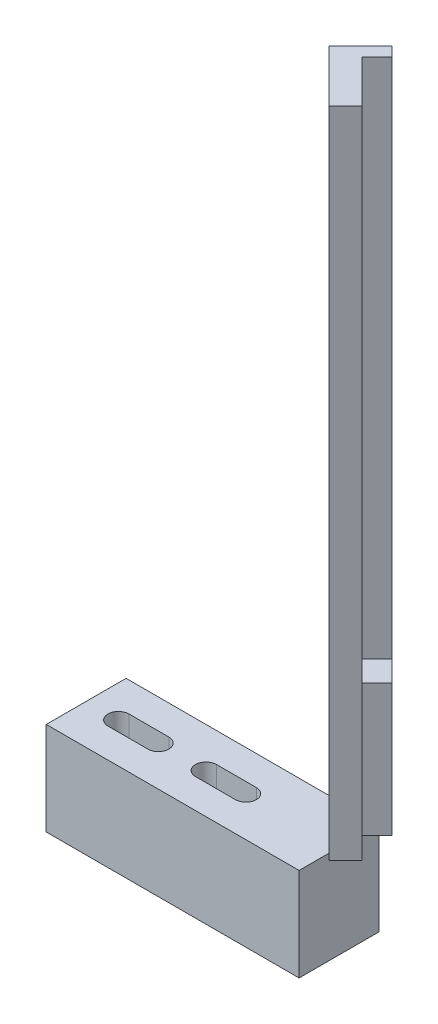
ISO-10303-21;
HEADER;
FILE_DESCRIPTION(('STEP AP214'),'2;1');
FILE_NAME('part.step','',(''),(''),'','','');
FILE_SCHEMA(('AUTOMOTIVE_DESIGN { 1 0 10303 214 1 1 1 1 }'));
ENDSEC;
DATA;
#1=APPLICATION_CONTEXT('core data for automotive mechanical design processes');
#2=APPLICATION_PROTOCOL_DEFINITION('international standard','automotive_design',2000,#1);
#3=PRODUCT_CONTEXT('',#1,'mechanical');
#4=PRODUCT('Part','Part','',(#3));
#5=PRODUCT_RELATED_PRODUCT_CATEGORY('part','',(#4));
#6=PRODUCT_DEFINITION_FORMATION('','',#4);
#7=PRODUCT_DEFINITION_CONTEXT('part definition',#1,'design');
#8=PRODUCT_DEFINITION('design','',#6,#7);
#9=PRODUCT_DEFINITION_SHAPE('','',#8);
#10=(LENGTH_UNIT() NAMED_UNIT(*) SI_UNIT(.MILLI.,.METRE.));
#11=(NAMED_UNIT(*) PLANE_ANGLE_UNIT() SI_UNIT($,.RADIAN.));
#12=(NAMED_UNIT(*) SI_UNIT($,.STERADIAN.) SOLID_ANGLE_UNIT());
#13=UNCERTAINTY_MEASURE_WITH_UNIT(LENGTH_MEASURE(1.E-05),#10,'distance_accuracy_value','');
#14=(GEOMETRIC_REPRESENTATION_CONTEXT(3) GLOBAL_UNCERTAINTY_ASSIGNED_CONTEXT((#13)) GLOBAL_UNIT_ASSIGNED_CONTEXT((#10,
#11,#12)) REPRESENTATION_CONTEXT('',''));
#15=CARTESIAN_POINT('',(0.,0.,0.));
#16=DIRECTION('',(0.,0.,1.));
#17=DIRECTION('',(1.,0.,0.));
#18=AXIS2_PLACEMENT_3D('',#15,#16,#17);
#19=CARTESIAN_POINT('',(30.1404135797826,142.4999944,-30.1404135797826));
#20=DIRECTION('',(-0.707106781186547,0.,0.707106781186548));
#21=DIRECTION('',(0.707106781186548,0.,0.707106781186547));
#22=AXIS2_PLACEMENT_3D('',#19,#20,#21);
#23=PLANE('',#22);
#24=CARTESIAN_POINT('',(48.0646243137283,56.6999882,-12.2162028458368));
#25=DIRECTION('',(0.707106781186551,0.,-0.707106781186544));
#26=DIRECTION('',(-0.707106781186544,0.,-0.707106781186551));
#27=AXIS2_PLACEMENT_3D('',#24,#25,#26);
#28=CIRCLE('',#27,0.749999999999987);
#29=CARTESIAN_POINT('',(47.5342942278384,56.6999882,-12.7465329317267));
#30=VERTEX_POINT('',#29);
#31=EDGE_CURVE('E388',#30,#30,#28,.T.);
#32=ORIENTED_EDGE('',*,*,#31,.F.);
#33=EDGE_LOOP('',(#32));
#34=FACE_BOUND('',#33,.T.);
#35=DIRECTION('',(0.,-1.,0.));
#36=VECTOR('',#35,1.);
#37=CARTESIAN_POINT('',(48.4888834029946,42.9999902,-11.7919437565706));
#38=LINE('',#37,#36);
#39=CARTESIAN_POINT('',(48.4888834029946,42.9999902,-11.7919437565706));
#40=VERTEX_POINT('',#39);
#41=CARTESIAN_POINT('',(48.4888834029946,17.78,-11.7919437565707));
#42=VERTEX_POINT('',#41);
#43=EDGE_CURVE('E54',#40,#42,#38,.T.);
#44=ORIENTED_EDGE('',*,*,#43,.F.);
#45=DIRECTION('',(-0.707106781186548,0.,-0.707106781186547));
#46=VECTOR('',#45,1.);
#47=CARTESIAN_POINT('',(30.1404135797826,42.9999902,-30.1404135797826));
#48=LINE('',#47,#46);
#49=CARTESIAN_POINT('',(44.5290974788637,42.9999902,-15.7517296807016));
#50=VERTEX_POINT('',#49);
#51=EDGE_CURVE('E59',#40,#50,#48,.T.);
#52=ORIENTED_EDGE('',*,*,#51,.T.);
#53=DIRECTION('',(0.,-1.,0.));
#54=VECTOR('',#53,1.);
#55=CARTESIAN_POINT('',(44.5290974788637,142.4999944,-15.7517296807016));
#56=LINE('',#55,#54);
#57=CARTESIAN_POINT('',(44.5290974788637,142.4999944,-15.7517296807016));
#58=VERTEX_POINT('',#57);
#59=EDGE_CURVE('E240',#58,#50,#56,.T.);
#60=ORIENTED_EDGE('',*,*,#59,.F.);
#61=DIRECTION('',(-0.707106781186548,0.,-0.707106781186547));
#62=VECTOR('',#61,1.);
#63=CARTESIAN_POINT('',(30.1404135797826,142.4999944,-30.1404135797826));
#64=LINE('',#63,#62);
#65=CARTESIAN_POINT('',(52.6608284168011,142.4999944,-7.61999874276412));
#66=VERTEX_POINT('',#65);
#67=EDGE_CURVE('E217',#66,#58,#64,.T.);
#68=ORIENTED_EDGE('',*,*,#67,.F.);
#69=DIRECTION('',(0.,-1.,0.));
#70=VECTOR('',#69,1.);
#71=CARTESIAN_POINT('',(52.6608284168011,142.4999944,-7.61999874276412));
#72=LINE('',#71,#70);
#73=CARTESIAN_POINT('',(52.6608284168012,17.78,-7.61999874276412));
#74=VERTEX_POINT('',#73);
#75=EDGE_CURVE('E242',#66,#74,#72,.T.);
#76=ORIENTED_EDGE('',*,*,#75,.T.);
#77=DIRECTION('',(-0.707106781186548,0.,-0.707106781186547));
#78=VECTOR('',#77,1.);
#79=CARTESIAN_POINT('',(30.1404135797826,17.78,-30.1404135797826));
#80=LINE('',#79,#78);
#81=EDGE_CURVE('E234',#74,#42,#80,.T.);
#82=ORIENTED_EDGE('',*,*,#81,.T.);
#83=EDGE_LOOP('',(#44,#52,#60,#68,#76,#82));
#84=FACE_BOUND('',#83,.T.);
#85=CARTESIAN_POINT('',(50.5748573467386,126.6998482,-9.70596981282662));
#86=DIRECTION('',(0.707106781186547,0.,-0.707106781186548));
#87=DIRECTION('',(-0.707106781186548,0.,-0.707106781186547));
#88=AXIS2_PLACEMENT_3D('',#85,#86,#87);
#89=CIRCLE('',#88,1.275);
#90=CARTESIAN_POINT('',(49.6732962007258,126.6998482,-10.6075309588395));
#91=VERTEX_POINT('',#90);
#92=EDGE_CURVE('E394',#91,#91,#89,.T.);
#93=ORIENTED_EDGE('',*,*,#92,.F.);
#94=EDGE_LOOP('',(#93));
#95=FACE_BOUND('',#94,.T.);
#96=CARTESIAN_POINT('',(50.5748573467386,56.6999882,-9.70596981282663));
#97=DIRECTION('',(0.707106781186547,0.,-0.707106781186548));
#98=DIRECTION('',(-0.707106781186548,0.,-0.707106781186547));
#99=AXIS2_PLACEMENT_3D('',#96,#97,#98);
#100=CIRCLE('',#99,1.27499999999998);
#101=CARTESIAN_POINT('',(49.6732962007258,56.6999882,-10.6075309588395));
#102=VERTEX_POINT('',#101);
#103=EDGE_CURVE('E400',#102,#102,#100,.T.);
#104=ORIENTED_EDGE('',*,*,#103,.F.);
#105=EDGE_LOOP('',(#104));
#106=FACE_BOUND('',#105,.T.);
#107=ADVANCED_FACE('F37',(#34,#84,#95,#106),#23,.F.);
#108=CARTESIAN_POINT('',(0.,17.78,-15.24));
#109=DIRECTION('',(0.,1.,0.));
#110=DIRECTION('',(0.,0.,1.));
#111=AXIS2_PLACEMENT_3D('',#108,#109,#110);
#112=PLANE('',#111);
#113=CARTESIAN_POINT('',(30.48,17.78,-7.62));
#114=DIRECTION('',(0.,1.,0.));
#115=DIRECTION('',(0.,0.,1.));
#116=AXIS2_PLACEMENT_3D('',#113,#114,#115);
#117=CIRCLE('',#116,2.);
#118=CARTESIAN_POINT('',(30.48,17.78,-5.62));
#119=VERTEX_POINT('',#118);
#120=CARTESIAN_POINT('',(30.48,17.78,-9.62));
#121=VERTEX_POINT('',#120);
#122=EDGE_CURVE('E265',#119,#121,#117,.T.);
#123=ORIENTED_EDGE('',*,*,#122,.F.);
#124=DIRECTION('',(1.,0.,0.));
#125=VECTOR('',#124,1.);
#126=CARTESIAN_POINT('',(30.48,17.78,-5.62));
#127=LINE('',#126,#125);
#128=CARTESIAN_POINT('',(22.86,17.78,-5.62));
#129=VERTEX_POINT('',#128);
#130=EDGE_CURVE('E255',#129,#119,#127,.T.);
#131=ORIENTED_EDGE('',*,*,#130,.F.);
#132=CARTESIAN_POINT('',(22.86,17.78,-7.62));
#133=DIRECTION('',(0.,1.,0.));
#134=DIRECTION('',(0.,0.,1.));
#135=AXIS2_PLACEMENT_3D('',#132,#133,#134);
#136=CIRCLE('',#135,2.);
#137=CARTESIAN_POINT('',(22.86,17.78,-9.62));
#138=VERTEX_POINT('',#137);
#139=EDGE_CURVE('E271',#138,#129,#136,.T.);
#140=ORIENTED_EDGE('',*,*,#139,.F.);
#141=DIRECTION('',(-1.,0.,0.));
#142=VECTOR('',#141,1.);
#143=CARTESIAN_POINT('',(30.48,17.78,-9.62));
#144=LINE('',#143,#142);
#145=EDGE_CURVE('E267',#121,#138,#144,.T.);
#146=ORIENTED_EDGE('',*,*,#145,.F.);
#147=EDGE_LOOP('',(#123,#131,#140,#146));
#148=FACE_BOUND('',#147,.T.);
#149=CARTESIAN_POINT('',(13.78,17.78,-7.61999999999999));
#150=DIRECTION('',(0.,1.,0.));
#151=DIRECTION('',(0.,0.,1.));
#152=AXIS2_PLACEMENT_3D('',#149,#150,#151);
#153=CIRCLE('',#152,2.);
#154=CARTESIAN_POINT('',(13.78,17.78,-5.61999999999999));
#155=VERTEX_POINT('',#154);
#156=CARTESIAN_POINT('',(13.78,17.78,-9.62));
#157=VERTEX_POINT('',#156);
#158=EDGE_CURVE('E250',#155,#157,#153,.T.);
#159=ORIENTED_EDGE('',*,*,#158,.F.);
#160=DIRECTION('',(1.,0.,0.));
#161=VECTOR('',#160,1.);
#162=CARTESIAN_POINT('',(13.78,17.78,-5.61999999999999));
#163=LINE('',#162,#161);
#164=CARTESIAN_POINT('',(6.15999999999996,17.78,-5.62));
#165=VERTEX_POINT('',#164);
#166=EDGE_CURVE('E289',#165,#155,#163,.T.);
#167=ORIENTED_EDGE('',*,*,#166,.F.);
#168=CARTESIAN_POINT('',(6.15999999999996,17.78,-7.62));
#169=DIRECTION('',(0.,1.,0.));
#170=DIRECTION('',(0.,0.,1.));
#171=AXIS2_PLACEMENT_3D('',#168,#169,#170);
#172=CIRCLE('',#171,2.);
#173=CARTESIAN_POINT('',(6.15999999999996,17.78,-9.61999999999999));
#174=VERTEX_POINT('',#173);
#175=EDGE_CURVE('E303',#174,#165,#172,.T.);
#176=ORIENTED_EDGE('',*,*,#175,.F.);
#177=DIRECTION('',(-1.,0.,0.));
#178=VECTOR('',#177,1.);
#179=CARTESIAN_POINT('',(13.78,17.78,-9.62));
#180=LINE('',#179,#178);
#181=EDGE_CURVE('E300',#157,#174,#180,.T.);
#182=ORIENTED_EDGE('',*,*,#181,.F.);
#183=EDGE_LOOP('',(#159,#167,#176,#182));
#184=FACE_BOUND('',#183,.T.);
#185=DIRECTION('',(0.707106781186549,0.,0.707106781186546));
#186=VECTOR('',#185,1.);
#187=CARTESIAN_POINT('',(26.9810243367396,17.78,-26.9810243367397));
#188=LINE('',#187,#186);
#189=CARTESIAN_POINT('',(39.5736570116069,17.78,-14.3883916618725));
#190=VERTEX_POINT('',#189);
#191=CARTESIAN_POINT('',(48.26,17.78,-5.70204867347936));
#192=VERTEX_POINT('',#191);
#193=EDGE_CURVE('E229',#190,#192,#188,.T.);
#194=ORIENTED_EDGE('',*,*,#193,.F.);
#195=DIRECTION('',(0.707106781186546,0.,-0.707106781186549));
#196=VECTOR('',#195,1.);
#197=CARTESIAN_POINT('',(12.5926326748673,17.78,12.5926326748672));
#198=LINE('',#197,#196);
#199=CARTESIAN_POINT('',(40.4252653497344,17.78,-15.24));
#200=VERTEX_POINT('',#199);
#201=EDGE_CURVE('E225',#190,#200,#198,.T.);
#202=ORIENTED_EDGE('',*,*,#201,.T.);
#203=DIRECTION('',(-1.,0.,0.));
#204=VECTOR('',#203,1.);
#205=CARTESIAN_POINT('',(0.,17.78,-15.24));
#206=LINE('',#205,#204);
#207=CARTESIAN_POINT('',(0.,17.78,-15.24));
#208=VERTEX_POINT('',#207);
#209=EDGE_CURVE('E324',#200,#208,#206,.T.);
#210=ORIENTED_EDGE('',*,*,#209,.T.);
#211=DIRECTION('',(0.,0.,1.));
#212=VECTOR('',#211,1.);
#213=CARTESIAN_POINT('',(0.,17.78,-15.24));
#214=LINE('',#213,#212);
#215=CARTESIAN_POINT('',(0.,17.78,0.));
#216=VERTEX_POINT('',#215);
#217=EDGE_CURVE('E11',#208,#216,#214,.T.);
#218=ORIENTED_EDGE('',*,*,#217,.T.);
#219=DIRECTION('',(-1.,0.,0.));
#220=VECTOR('',#219,1.);
#221=CARTESIAN_POINT('',(0.,17.78,0.));
#222=LINE('',#221,#220);
#223=CARTESIAN_POINT('',(48.26,17.78,0.));
#224=VERTEX_POINT('',#223);
#225=EDGE_CURVE('E319',#224,#216,#222,.T.);
#226=ORIENTED_EDGE('',*,*,#225,.F.);
#227=DIRECTION('',(0.,0.,1.));
#228=VECTOR('',#227,1.);
#229=CARTESIAN_POINT('',(48.26,17.78,-15.24));
#230=LINE('',#229,#228);
#231=EDGE_CURVE('E337',#192,#224,#230,.T.);
#232=ORIENTED_EDGE('',*,*,#231,.F.);
#233=EDGE_LOOP('',(#194,#202,#210,#218,#226,#232));
#234=FACE_BOUND('',#233,.T.);
#235=ADVANCED_FACE('F354',(#148,#184,#234),#112,.T.);
#236=CARTESIAN_POINT('',(0.,0.,-15.24));
#237=DIRECTION('',(-1.,0.,0.));
#238=DIRECTION('',(0.,0.,1.));
#239=AXIS2_PLACEMENT_3D('',#236,#237,#238);
#240=PLANE('',#239);
#241=DIRECTION('',(0.,-1.,0.));
#242=VECTOR('',#241,1.);
#243=CARTESIAN_POINT('',(0.,0.,0.));
#244=LINE('',#243,#242);
#245=CARTESIAN_POINT('',(0.,0.,0.));
#246=VERTEX_POINT('',#245);
#247=EDGE_CURVE('E278',#216,#246,#244,.T.);
#248=ORIENTED_EDGE('',*,*,#247,.F.);
#249=ORIENTED_EDGE('',*,*,#217,.F.);
#250=DIRECTION('',(0.,-1.,0.));
#251=VECTOR('',#250,1.);
#252=CARTESIAN_POINT('',(0.,0.,-15.24));
#253=LINE('',#252,#251);
#254=CARTESIAN_POINT('',(0.,0.,-15.24));
#255=VERTEX_POINT('',#254);
#256=EDGE_CURVE('E315',#208,#255,#253,.T.);
#257=ORIENTED_EDGE('',*,*,#256,.T.);
#258=DIRECTION('',(0.,0.,1.));
#259=VECTOR('',#258,1.);
#260=CARTESIAN_POINT('',(0.,0.,-15.24));
#261=LINE('',#260,#259);
#262=EDGE_CURVE('E41',#255,#246,#261,.T.);
#263=ORIENTED_EDGE('',*,*,#262,.T.);
#264=EDGE_LOOP('',(#248,#249,#257,#263));
#265=FACE_BOUND('',#264,.T.);
#266=ADVANCED_FACE('F39',(#265),#240,.T.);
#267=CARTESIAN_POINT('',(48.26,0.,-15.24));
#268=DIRECTION('',(1.,0.,0.));
#269=DIRECTION('',(0.,0.,-1.));
#270=AXIS2_PLACEMENT_3D('',#267,#268,#269);
#271=PLANE('',#270);
#272=DIRECTION('',(0.,1.,0.));
#273=VECTOR('',#272,1.);
#274=CARTESIAN_POINT('',(48.26,0.,0.));
#275=LINE('',#274,#273);
#276=CARTESIAN_POINT('',(48.26,0.,0.));
#277=VERTEX_POINT('',#276);
#278=EDGE_CURVE('E332',#277,#224,#275,.T.);
#279=ORIENTED_EDGE('',*,*,#278,.F.);
#280=DIRECTION('',(0.,0.,1.));
#281=VECTOR('',#280,1.);
#282=CARTESIAN_POINT('',(48.26,0.,-15.24));
#283=LINE('',#282,#281);
#284=CARTESIAN_POINT('',(48.26,0.,-15.24));
#285=VERTEX_POINT('',#284);
#286=EDGE_CURVE('E338',#285,#277,#283,.T.);
#287=ORIENTED_EDGE('',*,*,#286,.F.);
#288=DIRECTION('',(0.,1.,0.));
#289=VECTOR('',#288,1.);
#290=CARTESIAN_POINT('',(48.26,0.,-15.24));
#291=LINE('',#290,#289);
#292=CARTESIAN_POINT('',(48.26,17.78,-15.24));
#293=VERTEX_POINT('',#292);
#294=EDGE_CURVE('E322',#285,#293,#291,.T.);
#295=ORIENTED_EDGE('',*,*,#294,.T.);
#296=EDGE_CURVE('E46',#293,#192,#230,.T.);
#297=ORIENTED_EDGE('',*,*,#296,.T.);
#298=ORIENTED_EDGE('',*,*,#231,.T.);
#299=EDGE_LOOP('',(#279,#287,#295,#297,#298));
#300=FACE_BOUND('',#299,.T.);
#301=ADVANCED_FACE('F364',(#300),#271,.T.);
#302=CARTESIAN_POINT('',(0.,0.,-15.24));
#303=DIRECTION('',(0.,-1.,0.));
#304=DIRECTION('',(0.,0.,-1.));
#305=AXIS2_PLACEMENT_3D('',#302,#303,#304);
#306=PLANE('',#305);
#307=CARTESIAN_POINT('',(30.48,0.,-7.62));
#308=DIRECTION('',(0.,1.,0.));
#309=DIRECTION('',(0.,0.,1.));
#310=AXIS2_PLACEMENT_3D('',#307,#308,#309);
#311=CIRCLE('',#310,2.);
#312=CARTESIAN_POINT('',(30.48,0.,-5.62));
#313=VERTEX_POINT('',#312);
#314=CARTESIAN_POINT('',(30.48,0.,-9.62));
#315=VERTEX_POINT('',#314);
#316=EDGE_CURVE('E251',#313,#315,#311,.T.);
#317=ORIENTED_EDGE('',*,*,#316,.T.);
#318=DIRECTION('',(-1.,0.,0.));
#319=VECTOR('',#318,1.);
#320=CARTESIAN_POINT('',(30.48,0.,-9.62));
#321=LINE('',#320,#319);
#322=CARTESIAN_POINT('',(22.86,0.,-9.62));
#323=VERTEX_POINT('',#322);
#324=EDGE_CURVE('E254',#315,#323,#321,.T.);
#325=ORIENTED_EDGE('',*,*,#324,.T.);
#326=CARTESIAN_POINT('',(22.86,0.,-7.62));
#327=DIRECTION('',(0.,1.,0.));
#328=DIRECTION('',(0.,0.,1.));
#329=AXIS2_PLACEMENT_3D('',#326,#327,#328);
#330=CIRCLE('',#329,2.);
#331=CARTESIAN_POINT('',(22.86,0.,-5.62));
#332=VERTEX_POINT('',#331);
#333=EDGE_CURVE('E258',#323,#332,#330,.T.);
#334=ORIENTED_EDGE('',*,*,#333,.T.);
#335=DIRECTION('',(1.,0.,0.));
#336=VECTOR('',#335,1.);
#337=CARTESIAN_POINT('',(30.48,0.,-5.62));
#338=LINE('',#337,#336);
#339=EDGE_CURVE('E261',#332,#313,#338,.T.);
#340=ORIENTED_EDGE('',*,*,#339,.T.);
#341=EDGE_LOOP('',(#317,#325,#334,#340));
#342=FACE_BOUND('',#341,.T.);
#343=CARTESIAN_POINT('',(13.78,0.,-7.61999999999999));
#344=DIRECTION('',(0.,1.,0.));
#345=DIRECTION('',(0.,0.,1.));
#346=AXIS2_PLACEMENT_3D('',#343,#344,#345);
#347=CIRCLE('',#346,2.);
#348=CARTESIAN_POINT('',(13.78,0.,-5.61999999999999));
#349=VERTEX_POINT('',#348);
#350=CARTESIAN_POINT('',(13.78,0.,-9.62));
#351=VERTEX_POINT('',#350);
#352=EDGE_CURVE('E285',#349,#351,#347,.T.);
#353=ORIENTED_EDGE('',*,*,#352,.T.);
#354=DIRECTION('',(-1.,0.,0.));
#355=VECTOR('',#354,1.);
#356=CARTESIAN_POINT('',(13.78,0.,-9.62));
#357=LINE('',#356,#355);
#358=CARTESIAN_POINT('',(6.15999999999996,0.,-9.62));
#359=VERTEX_POINT('',#358);
#360=EDGE_CURVE('E288',#351,#359,#357,.T.);
#361=ORIENTED_EDGE('',*,*,#360,.T.);
#362=CARTESIAN_POINT('',(6.15999999999996,0.,-7.62));
#363=DIRECTION('',(0.,1.,0.));
#364=DIRECTION('',(0.,0.,1.));
#365=AXIS2_PLACEMENT_3D('',#362,#363,#364);
#366=CIRCLE('',#365,2.);
#367=CARTESIAN_POINT('',(6.15999999999996,0.,-5.62));
#368=VERTEX_POINT('',#367);
#369=EDGE_CURVE('E292',#359,#368,#366,.T.);
#370=ORIENTED_EDGE('',*,*,#369,.T.);
#371=DIRECTION('',(1.,0.,0.));
#372=VECTOR('',#371,1.);
#373=CARTESIAN_POINT('',(13.78,0.,-5.61999999999999));
#374=LINE('',#373,#372);
#375=EDGE_CURVE('E295',#368,#349,#374,.T.);
#376=ORIENTED_EDGE('',*,*,#375,.T.);
#377=EDGE_LOOP('',(#353,#361,#370,#376));
#378=FACE_BOUND('',#377,.T.);
#379=DIRECTION('',(1.,0.,0.));
#380=VECTOR('',#379,1.);
#381=CARTESIAN_POINT('',(0.,0.,0.));
#382=LINE('',#381,#380);
#383=EDGE_CURVE('E329',#246,#277,#382,.T.);
#384=ORIENTED_EDGE('',*,*,#383,.F.);
#385=ORIENTED_EDGE('',*,*,#262,.F.);
#386=DIRECTION('',(1.,0.,0.));
#387=VECTOR('',#386,1.);
#388=CARTESIAN_POINT('',(0.,0.,-15.24));
#389=LINE('',#388,#387);
#390=EDGE_CURVE('E318',#255,#285,#389,.T.);
#391=ORIENTED_EDGE('',*,*,#390,.T.);
#392=ORIENTED_EDGE('',*,*,#286,.T.);
#393=EDGE_LOOP('',(#384,#385,#391,#392));
#394=FACE_BOUND('',#393,.T.);
#395=ADVANCED_FACE('F347',(#342,#378,#394),#306,.T.);
#396=CARTESIAN_POINT('',(0.,0.,-15.24));
#397=DIRECTION('',(0.,0.,-1.));
#398=DIRECTION('',(-1.,0.,0.));
#399=AXIS2_PLACEMENT_3D('',#396,#397,#398);
#400=PLANE('',#399);
#401=ORIENTED_EDGE('',*,*,#256,.F.);
#402=ORIENTED_EDGE('',*,*,#209,.F.);
#403=EDGE_CURVE('E325',#293,#200,#206,.T.);
#404=ORIENTED_EDGE('',*,*,#403,.F.);
#405=ORIENTED_EDGE('',*,*,#294,.F.);
#406=ORIENTED_EDGE('',*,*,#390,.F.);
#407=EDGE_LOOP('',(#401,#402,#404,#405,#406));
#408=FACE_BOUND('',#407,.T.);
#409=ADVANCED_FACE('F358',(#408),#400,.T.);
#410=CARTESIAN_POINT('',(0.,0.,0.));
#411=DIRECTION('',(0.,0.,-1.));
#412=DIRECTION('',(-1.,0.,0.));
#413=AXIS2_PLACEMENT_3D('',#410,#411,#412);
#414=PLANE('',#413);
#415=ORIENTED_EDGE('',*,*,#247,.T.);
#416=ORIENTED_EDGE('',*,*,#383,.T.);
#417=ORIENTED_EDGE('',*,*,#278,.T.);
#418=ORIENTED_EDGE('',*,*,#225,.T.);
#419=EDGE_LOOP('',(#415,#416,#417,#418));
#420=FACE_BOUND('',#419,.T.);
#421=ADVANCED_FACE('F349',(#420),#414,.F.);
#422=CARTESIAN_POINT('',(13.78,0.,-7.61999999999999));
#423=DIRECTION('',(0.,1.,0.));
#424=DIRECTION('',(0.,0.,1.));
#425=AXIS2_PLACEMENT_3D('',#422,#423,#424);
#426=CYLINDRICAL_SURFACE('',#425,2.);
#427=ORIENTED_EDGE('',*,*,#158,.T.);
#428=DIRECTION('',(0.,1.,0.));
#429=VECTOR('',#428,1.);
#430=CARTESIAN_POINT('',(13.78,0.,-9.62));
#431=LINE('',#430,#429);
#432=EDGE_CURVE('E298',#351,#157,#431,.T.);
#433=ORIENTED_EDGE('',*,*,#432,.F.);
#434=ORIENTED_EDGE('',*,*,#352,.F.);
#435=DIRECTION('',(0.,1.,0.));
#436=VECTOR('',#435,1.);
#437=CARTESIAN_POINT('',(13.78,0.,-5.61999999999999));
#438=LINE('',#437,#436);
#439=EDGE_CURVE('E268',#349,#155,#438,.T.);
#440=ORIENTED_EDGE('',*,*,#439,.T.);
#441=EDGE_LOOP('',(#427,#433,#434,#440));
#442=FACE_BOUND('',#441,.T.);
#443=ADVANCED_FACE('F448',(#442),#426,.F.);
#444=CARTESIAN_POINT('',(13.78,0.,-5.61999999999999));
#445=DIRECTION('',(0.,0.,1.));
#446=DIRECTION('',(1.,0.,0.));
#447=AXIS2_PLACEMENT_3D('',#444,#445,#446);
#448=PLANE('',#447);
#449=ORIENTED_EDGE('',*,*,#166,.T.);
#450=ORIENTED_EDGE('',*,*,#439,.F.);
#451=ORIENTED_EDGE('',*,*,#375,.F.);
#452=DIRECTION('',(0.,1.,0.));
#453=VECTOR('',#452,1.);
#454=CARTESIAN_POINT('',(6.15999999999996,0.,-5.62));
#455=LINE('',#454,#453);
#456=EDGE_CURVE('E309',#368,#165,#455,.T.);
#457=ORIENTED_EDGE('',*,*,#456,.T.);
#458=EDGE_LOOP('',(#449,#450,#451,#457));
#459=FACE_BOUND('',#458,.T.);
#460=ADVANCED_FACE('F444',(#459),#448,.F.);
#461=CARTESIAN_POINT('',(6.15999999999996,0.,-7.62));
#462=DIRECTION('',(0.,1.,0.));
#463=DIRECTION('',(0.,0.,1.));
#464=AXIS2_PLACEMENT_3D('',#461,#462,#463);
#465=CYLINDRICAL_SURFACE('',#464,2.);
#466=ORIENTED_EDGE('',*,*,#175,.T.);
#467=ORIENTED_EDGE('',*,*,#456,.F.);
#468=ORIENTED_EDGE('',*,*,#369,.F.);
#469=DIRECTION('',(0.,1.,0.));
#470=VECTOR('',#469,1.);
#471=CARTESIAN_POINT('',(6.15999999999996,0.,-9.61999999999999));
#472=LINE('',#471,#470);
#473=EDGE_CURVE('E311',#359,#174,#472,.T.);
#474=ORIENTED_EDGE('',*,*,#473,.T.);
#475=EDGE_LOOP('',(#466,#467,#468,#474));
#476=FACE_BOUND('',#475,.T.);
#477=ADVANCED_FACE('F447',(#476),#465,.F.);
#478=CARTESIAN_POINT('',(13.78,0.,-9.62));
#479=DIRECTION('',(0.,0.,-1.));
#480=DIRECTION('',(-1.,0.,0.));
#481=AXIS2_PLACEMENT_3D('',#478,#479,#480);
#482=PLANE('',#481);
#483=ORIENTED_EDGE('',*,*,#181,.T.);
#484=ORIENTED_EDGE('',*,*,#473,.F.);
#485=ORIENTED_EDGE('',*,*,#360,.F.);
#486=ORIENTED_EDGE('',*,*,#432,.T.);
#487=EDGE_LOOP('',(#483,#484,#485,#486));
#488=FACE_BOUND('',#487,.T.);
#489=ADVANCED_FACE('F442',(#488),#482,.F.);
#490=CARTESIAN_POINT('',(30.48,0.,-7.62));
#491=DIRECTION('',(0.,1.,0.));
#492=DIRECTION('',(0.,0.,1.));
#493=AXIS2_PLACEMENT_3D('',#490,#491,#492);
#494=CYLINDRICAL_SURFACE('',#493,2.);
#495=ORIENTED_EDGE('',*,*,#122,.T.);
#496=DIRECTION('',(0.,1.,0.));
#497=VECTOR('',#496,1.);
#498=CARTESIAN_POINT('',(30.48,0.,-9.62));
#499=LINE('',#498,#497);
#500=EDGE_CURVE('E264',#315,#121,#499,.T.);
#501=ORIENTED_EDGE('',*,*,#500,.F.);
#502=ORIENTED_EDGE('',*,*,#316,.F.);
#503=DIRECTION('',(0.,1.,0.));
#504=VECTOR('',#503,1.);
#505=CARTESIAN_POINT('',(30.48,0.,-5.62));
#506=LINE('',#505,#504);
#507=EDGE_CURVE('E276',#313,#119,#506,.T.);
#508=ORIENTED_EDGE('',*,*,#507,.T.);
#509=EDGE_LOOP('',(#495,#501,#502,#508));
#510=FACE_BOUND('',#509,.T.);
#511=ADVANCED_FACE('F431',(#510),#494,.F.);
#512=CARTESIAN_POINT('',(30.48,0.,-5.62));
#513=DIRECTION('',(0.,0.,1.));
#514=DIRECTION('',(1.,0.,0.));
#515=AXIS2_PLACEMENT_3D('',#512,#513,#514);
#516=PLANE('',#515);
#517=ORIENTED_EDGE('',*,*,#130,.T.);
#518=ORIENTED_EDGE('',*,*,#507,.F.);
#519=ORIENTED_EDGE('',*,*,#339,.F.);
#520=DIRECTION('',(0.,1.,0.));
#521=VECTOR('',#520,1.);
#522=CARTESIAN_POINT('',(22.86,0.,-5.62));
#523=LINE('',#522,#521);
#524=EDGE_CURVE('E279',#332,#129,#523,.T.);
#525=ORIENTED_EDGE('',*,*,#524,.T.);
#526=EDGE_LOOP('',(#517,#518,#519,#525));
#527=FACE_BOUND('',#526,.T.);
#528=ADVANCED_FACE('F427',(#527),#516,.F.);
#529=CARTESIAN_POINT('',(22.86,0.,-7.62));
#530=DIRECTION('',(0.,1.,0.));
#531=DIRECTION('',(0.,0.,1.));
#532=AXIS2_PLACEMENT_3D('',#529,#530,#531);
#533=CYLINDRICAL_SURFACE('',#532,2.);
#534=ORIENTED_EDGE('',*,*,#139,.T.);
#535=ORIENTED_EDGE('',*,*,#524,.F.);
#536=ORIENTED_EDGE('',*,*,#333,.F.);
#537=DIRECTION('',(0.,1.,0.));
#538=VECTOR('',#537,1.);
#539=CARTESIAN_POINT('',(22.86,0.,-9.62));
#540=LINE('',#539,#538);
#541=EDGE_CURVE('E281',#323,#138,#540,.T.);
#542=ORIENTED_EDGE('',*,*,#541,.T.);
#543=EDGE_LOOP('',(#534,#535,#536,#542));
#544=FACE_BOUND('',#543,.T.);
#545=ADVANCED_FACE('F430',(#544),#533,.F.);
#546=CARTESIAN_POINT('',(30.48,0.,-9.62));
#547=DIRECTION('',(0.,0.,-1.));
#548=DIRECTION('',(-1.,0.,0.));
#549=AXIS2_PLACEMENT_3D('',#546,#547,#548);
#550=PLANE('',#549);
#551=ORIENTED_EDGE('',*,*,#145,.T.);
#552=ORIENTED_EDGE('',*,*,#541,.F.);
#553=ORIENTED_EDGE('',*,*,#324,.F.);
#554=ORIENTED_EDGE('',*,*,#500,.T.);
#555=EDGE_LOOP('',(#551,#552,#553,#554));
#556=FACE_BOUND('',#555,.T.);
#557=ADVANCED_FACE('F435',(#556),#550,.F.);
#558=CARTESIAN_POINT('',(0.,17.78,0.));
#559=DIRECTION('',(0.,1.,0.));
#560=DIRECTION('',(-1.,0.,0.));
#561=AXIS2_PLACEMENT_3D('',#558,#559,#560);
#562=PLANE('',#561);
#563=ORIENTED_EDGE('',*,*,#403,.T.);
#564=CARTESIAN_POINT('',(45.5614689566432,17.78,-20.3762036069088));
#565=VERTEX_POINT('',#564);
#566=EDGE_CURVE('E208',#200,#565,#198,.T.);
#567=ORIENTED_EDGE('',*,*,#566,.T.);
#568=DIRECTION('',(0.707106781186545,0.,0.70710678118655));
#569=VECTOR('',#568,1.);
#570=CARTESIAN_POINT('',(32.9688362817761,17.78,-32.9688362817759));
#571=LINE('',#570,#569);
#572=CARTESIAN_POINT('',(51.317306104988,17.78,-14.620366458564));
#573=VERTEX_POINT('',#572);
#574=EDGE_CURVE('E213',#565,#573,#571,.T.);
#575=ORIENTED_EDGE('',*,*,#574,.T.);
#576=DIRECTION('',(0.707106781186548,0.,-0.707106781186547));
#577=VECTOR('',#576,1.);
#578=CARTESIAN_POINT('',(18.3484698232119,17.78,18.348469823212));
#579=LINE('',#578,#577);
#580=EDGE_CURVE('E193',#42,#573,#579,.T.);
#581=ORIENTED_EDGE('',*,*,#580,.F.);
#582=ORIENTED_EDGE('',*,*,#81,.F.);
#583=DIRECTION('',(0.707106781186548,0.,-0.707106781186547));
#584=VECTOR('',#583,1.);
#585=CARTESIAN_POINT('',(22.5204148370185,17.78,22.5204148370185));
#586=LINE('',#585,#584);
#587=CARTESIAN_POINT('',(49.5014391737582,17.78,-4.46060949972116));
#588=VERTEX_POINT('',#587);
#589=EDGE_CURVE('E232',#588,#74,#586,.T.);
#590=ORIENTED_EDGE('',*,*,#589,.F.);
#591=EDGE_CURVE('E228',#192,#588,#188,.T.);
#592=ORIENTED_EDGE('',*,*,#591,.F.);
#593=ORIENTED_EDGE('',*,*,#296,.F.);
#594=EDGE_LOOP('',(#563,#567,#575,#581,#582,#590,#592,#593));
#595=FACE_BOUND('',#594,.T.);
#596=ADVANCED_FACE('F366',(#595),#562,.F.);
#597=CARTESIAN_POINT('',(12.5926326748673,142.4999944,12.5926326748672));
#598=DIRECTION('',(-0.707106781186549,0.,-0.707106781186546));
#599=DIRECTION('',(-0.707106781186546,0.,0.707106781186549));
#600=AXIS2_PLACEMENT_3D('',#597,#598,#599);
#601=PLANE('',#600);
#602=ORIENTED_EDGE('',*,*,#566,.F.);
#603=ORIENTED_EDGE('',*,*,#201,.F.);
#604=DIRECTION('',(0.,-1.,0.));
#605=VECTOR('',#604,1.);
#606=CARTESIAN_POINT('',(39.5736570116068,142.4999944,-14.3883916618725));
#607=LINE('',#606,#605);
#608=CARTESIAN_POINT('',(39.5736570116068,142.4999944,-14.3883916618725));
#609=VERTEX_POINT('',#608);
#610=EDGE_CURVE('E248',#609,#190,#607,.T.);
#611=ORIENTED_EDGE('',*,*,#610,.F.);
#612=DIRECTION('',(0.707106781186546,0.,-0.707106781186549));
#613=VECTOR('',#612,1.);
#614=CARTESIAN_POINT('',(12.5926326748673,142.4999944,12.5926326748672));
#615=LINE('',#614,#613);
#616=CARTESIAN_POINT('',(45.5614689566431,142.4999944,-20.3762036069088));
#617=VERTEX_POINT('',#616);
#618=EDGE_CURVE('E209',#609,#617,#615,.T.);
#619=ORIENTED_EDGE('',*,*,#618,.T.);
#620=DIRECTION('',(0.,-1.,0.));
#621=VECTOR('',#620,1.);
#622=CARTESIAN_POINT('',(45.5614689566431,142.4999944,-20.3762036069088));
#623=LINE('',#622,#621);
#624=EDGE_CURVE('E224',#617,#565,#623,.T.);
#625=ORIENTED_EDGE('',*,*,#624,.T.);
#626=EDGE_LOOP('',(#602,#603,#611,#619,#625));
#627=FACE_BOUND('',#626,.T.);
#628=ADVANCED_FACE('F375',(#627),#601,.T.);
#629=CARTESIAN_POINT('',(26.9810243367396,142.4999944,-26.9810243367397));
#630=DIRECTION('',(0.707106781186546,0.,-0.707106781186549));
#631=DIRECTION('',(-0.707106781186549,0.,-0.707106781186546));
#632=AXIS2_PLACEMENT_3D('',#629,#630,#631);
#633=PLANE('',#632);
#634=CARTESIAN_POINT('',(47.4154681036957,56.6999882,-6.54658056978367));
#635=DIRECTION('',(0.707106781186546,0.,-0.707106781186549));
#636=DIRECTION('',(-0.707106781186549,0.,-0.707106781186546));
#637=AXIS2_PLACEMENT_3D('',#634,#635,#636);
#638=CIRCLE('',#637,1.27499999999999);
#639=CARTESIAN_POINT('',(46.5139069576828,56.6999882,-7.44814171579652));
#640=VERTEX_POINT('',#639);
#641=EDGE_CURVE('E397',#640,#640,#638,.T.);
#642=ORIENTED_EDGE('',*,*,#641,.T.);
#643=EDGE_LOOP('',(#642));
#644=FACE_BOUND('',#643,.T.);
#645=CARTESIAN_POINT('',(47.4154681036957,126.6998482,-6.54658056978366));
#646=DIRECTION('',(0.707106781186546,0.,-0.707106781186549));
#647=DIRECTION('',(-0.707106781186549,0.,-0.707106781186546));
#648=AXIS2_PLACEMENT_3D('',#645,#646,#647);
#649=CIRCLE('',#648,1.275);
#650=CARTESIAN_POINT('',(46.5139069576828,126.6998482,-7.44814171579651));
#651=VERTEX_POINT('',#650);
#652=EDGE_CURVE('E391',#651,#651,#649,.T.);
#653=ORIENTED_EDGE('',*,*,#652,.T.);
#654=EDGE_LOOP('',(#653));
#655=FACE_BOUND('',#654,.T.);
#656=CARTESIAN_POINT('',(44.9052350706854,56.6999882,-9.0568136027939));
#657=DIRECTION('',(0.707106781186546,0.,-0.707106781186549));
#658=DIRECTION('',(-0.707106781186549,0.,-0.707106781186546));
#659=AXIS2_PLACEMENT_3D('',#656,#657,#658);
#660=CIRCLE('',#659,0.74999999999999);
#661=CARTESIAN_POINT('',(44.3749049847955,56.6999882,-9.5871436886838));
#662=VERTEX_POINT('',#661);
#663=EDGE_CURVE('E205',#662,#662,#660,.T.);
#664=ORIENTED_EDGE('',*,*,#663,.T.);
#665=EDGE_LOOP('',(#664));
#666=FACE_BOUND('',#665,.T.);
#667=ORIENTED_EDGE('',*,*,#193,.T.);
#668=ORIENTED_EDGE('',*,*,#591,.T.);
#669=DIRECTION('',(0.,-1.,0.));
#670=VECTOR('',#669,1.);
#671=CARTESIAN_POINT('',(49.5014391737582,142.4999944,-4.46060949972116));
#672=LINE('',#671,#670);
#673=CARTESIAN_POINT('',(49.5014391737582,142.4999944,-4.46060949972116));
#674=VERTEX_POINT('',#673);
#675=EDGE_CURVE('E245',#674,#588,#672,.T.);
#676=ORIENTED_EDGE('',*,*,#675,.F.);
#677=DIRECTION('',(0.707106781186549,0.,0.707106781186546));
#678=VECTOR('',#677,1.);
#679=CARTESIAN_POINT('',(26.9810243367396,142.4999944,-26.9810243367397));
#680=LINE('',#679,#678);
#681=EDGE_CURVE('E212',#609,#674,#680,.T.);
#682=ORIENTED_EDGE('',*,*,#681,.F.);
#683=ORIENTED_EDGE('',*,*,#610,.T.);
#684=EDGE_LOOP('',(#667,#668,#676,#682,#683));
#685=FACE_BOUND('',#684,.T.);
#686=ADVANCED_FACE('F371',(#644,#655,#666,#685),#633,.F.);
#687=CARTESIAN_POINT('',(22.5204148370184,142.4999944,22.5204148370185));
#688=DIRECTION('',(-0.707106781186547,0.,-0.707106781186548));
#689=DIRECTION('',(-0.707106781186548,0.,0.707106781186547));
#690=AXIS2_PLACEMENT_3D('',#687,#688,#689);
#691=PLANE('',#690);
#692=ORIENTED_EDGE('',*,*,#589,.T.);
#693=ORIENTED_EDGE('',*,*,#75,.F.);
#694=DIRECTION('',(0.707106781186548,0.,-0.707106781186547));
#695=VECTOR('',#694,1.);
#696=CARTESIAN_POINT('',(22.5204148370184,142.4999944,22.5204148370185));
#697=LINE('',#696,#695);
#698=EDGE_CURVE('E215',#674,#66,#697,.T.);
#699=ORIENTED_EDGE('',*,*,#698,.F.);
#700=ORIENTED_EDGE('',*,*,#675,.T.);
#701=EDGE_LOOP('',(#692,#693,#699,#700));
#702=FACE_BOUND('',#701,.T.);
#703=ADVANCED_FACE('F418',(#702),#691,.F.);
#704=CARTESIAN_POINT('',(14.3886838990802,142.4999944,14.3886838990808));
#705=DIRECTION('',(0.707106781186535,0.,0.70710678118656));
#706=DIRECTION('',(0.70710678118656,0.,-0.707106781186535));
#707=AXIS2_PLACEMENT_3D('',#704,#705,#706);
#708=PLANE('',#707);
#709=DIRECTION('',(-0.70710678118656,0.,0.707106781186535));
#710=VECTOR('',#709,1.);
#711=CARTESIAN_POINT('',(14.3886838990802,42.9999902,14.3886838990808));
#712=LINE('',#711,#710);
#713=CARTESIAN_POINT('',(47.357520180857,42.9999902,-18.5801523826949));
#714=VERTEX_POINT('',#713);
#715=EDGE_CURVE('E204',#714,#50,#712,.T.);
#716=ORIENTED_EDGE('',*,*,#715,.F.);
#717=DIRECTION('',(0.,-1.,0.));
#718=VECTOR('',#717,1.);
#719=CARTESIAN_POINT('',(47.357520180857,142.4999944,-18.5801523826949));
#720=LINE('',#719,#718);
#721=CARTESIAN_POINT('',(47.357520180857,142.4999944,-18.5801523826949));
#722=VERTEX_POINT('',#721);
#723=EDGE_CURVE('E200',#722,#714,#720,.T.);
#724=ORIENTED_EDGE('',*,*,#723,.F.);
#725=DIRECTION('',(-0.70710678118656,0.,0.707106781186535));
#726=VECTOR('',#725,1.);
#727=CARTESIAN_POINT('',(14.3886838990802,142.4999944,14.3886838990808));
#728=LINE('',#727,#726);
#729=EDGE_CURVE('E219',#722,#58,#728,.T.);
#730=ORIENTED_EDGE('',*,*,#729,.T.);
#731=ORIENTED_EDGE('',*,*,#59,.T.);
#732=EDGE_LOOP('',(#716,#724,#730,#731));
#733=FACE_BOUND('',#732,.T.);
#734=ADVANCED_FACE('F383',(#733),#708,.T.);
#735=CARTESIAN_POINT('',(32.9688362817761,142.4999944,-32.9688362817759));
#736=DIRECTION('',(0.70710678118655,0.,-0.707106781186545));
#737=DIRECTION('',(-0.707106781186545,0.,-0.70710678118655));
#738=AXIS2_PLACEMENT_3D('',#735,#736,#737);
#739=PLANE('',#738);
#740=ORIENTED_EDGE('',*,*,#574,.F.);
#741=ORIENTED_EDGE('',*,*,#624,.F.);
#742=DIRECTION('',(0.707106781186545,0.,0.70710678118655));
#743=VECTOR('',#742,1.);
#744=CARTESIAN_POINT('',(32.9688362817761,142.4999944,-32.9688362817759));
#745=LINE('',#744,#743);
#746=EDGE_CURVE('E222',#617,#722,#745,.T.);
#747=ORIENTED_EDGE('',*,*,#746,.T.);
#748=ORIENTED_EDGE('',*,*,#723,.T.);
#749=DIRECTION('',(-0.707106781186549,0.,-0.707106781186546));
#750=VECTOR('',#749,1.);
#751=CARTESIAN_POINT('',(32.9688362817759,42.9999902,-32.968836281776));
#752=LINE('',#751,#750);
#753=CARTESIAN_POINT('',(51.317306104988,42.9999902,-14.620366458564));
#754=VERTEX_POINT('',#753);
#755=EDGE_CURVE('E185',#754,#714,#752,.T.);
#756=ORIENTED_EDGE('',*,*,#755,.F.);
#757=DIRECTION('',(0.,-1.,0.));
#758=VECTOR('',#757,1.);
#759=CARTESIAN_POINT('',(51.317306104988,42.9999902,-14.620366458564));
#760=LINE('',#759,#758);
#761=EDGE_CURVE('E190',#754,#573,#760,.T.);
#762=ORIENTED_EDGE('',*,*,#761,.T.);
#763=EDGE_LOOP('',(#740,#741,#747,#748,#756,#762));
#764=FACE_BOUND('',#763,.T.);
#765=ADVANCED_FACE('F198',(#764),#739,.T.);
#766=CARTESIAN_POINT('',(0.,142.4999944,0.));
#767=DIRECTION('',(0.,1.,0.));
#768=DIRECTION('',(-1.,0.,0.));
#769=AXIS2_PLACEMENT_3D('',#766,#767,#768);
#770=PLANE('',#769);
#771=ORIENTED_EDGE('',*,*,#618,.F.);
#772=ORIENTED_EDGE('',*,*,#681,.T.);
#773=ORIENTED_EDGE('',*,*,#698,.T.);
#774=ORIENTED_EDGE('',*,*,#67,.T.);
#775=ORIENTED_EDGE('',*,*,#729,.F.);
#776=ORIENTED_EDGE('',*,*,#746,.F.);
#777=EDGE_LOOP('',(#771,#772,#773,#774,#775,#776));
#778=FACE_BOUND('',#777,.T.);
#779=ADVANCED_FACE('F380',(#778),#770,.T.);
#780=CARTESIAN_POINT('',(18.3484698232119,42.9999902,18.348469823212));
#781=DIRECTION('',(-0.707106781186547,0.,-0.707106781186548));
#782=DIRECTION('',(-0.707106781186548,0.,0.707106781186547));
#783=AXIS2_PLACEMENT_3D('',#780,#781,#782);
#784=PLANE('',#783);
#785=ORIENTED_EDGE('',*,*,#580,.T.);
#786=ORIENTED_EDGE('',*,*,#761,.F.);
#787=DIRECTION('',(0.707106781186548,0.,-0.707106781186547));
#788=VECTOR('',#787,1.);
#789=CARTESIAN_POINT('',(18.3484698232119,42.9999902,18.348469823212));
#790=LINE('',#789,#788);
#791=EDGE_CURVE('E180',#40,#754,#790,.T.);
#792=ORIENTED_EDGE('',*,*,#791,.F.);
#793=ORIENTED_EDGE('',*,*,#43,.T.);
#794=EDGE_LOOP('',(#785,#786,#792,#793));
#795=FACE_BOUND('',#794,.T.);
#796=ADVANCED_FACE('F191',(#795),#784,.F.);
#797=CARTESIAN_POINT('',(0.,42.9999902,0.));
#798=DIRECTION('',(0.,1.,0.));
#799=DIRECTION('',(-1.,0.,0.));
#800=AXIS2_PLACEMENT_3D('',#797,#798,#799);
#801=PLANE('',#800);
#802=ORIENTED_EDGE('',*,*,#715,.T.);
#803=ORIENTED_EDGE('',*,*,#51,.F.);
#804=ORIENTED_EDGE('',*,*,#791,.T.);
#805=ORIENTED_EDGE('',*,*,#755,.T.);
#806=EDGE_LOOP('',(#802,#803,#804,#805));
#807=FACE_BOUND('',#806,.T.);
#808=ADVANCED_FACE('F183',(#807),#801,.T.);
#809=CARTESIAN_POINT('',(48.0646243137283,56.6999882,-12.2162028458368));
#810=DIRECTION('',(0.707106781186551,0.,-0.707106781186544));
#811=DIRECTION('',(-0.707106781186544,0.,-0.707106781186551));
#812=AXIS2_PLACEMENT_3D('',#809,#810,#811);
#813=CYLINDRICAL_SURFACE('',#812,0.74999999999999);
#814=ORIENTED_EDGE('',*,*,#31,.T.);
#815=EDGE_LOOP('',(#814));
#816=FACE_BOUND('',#815,.T.);
#817=ORIENTED_EDGE('',*,*,#663,.F.);
#818=EDGE_LOOP('',(#817));
#819=FACE_BOUND('',#818,.T.);
#820=ADVANCED_FACE('F578',(#816,#819),#813,.F.);
#821=CARTESIAN_POINT('',(50.5748573467386,126.6998482,-9.70596981282662));
#822=DIRECTION('',(0.707106781186547,0.,-0.707106781186548));
#823=DIRECTION('',(-0.707106781186548,0.,-0.707106781186547));
#824=AXIS2_PLACEMENT_3D('',#821,#822,#823);
#825=CYLINDRICAL_SURFACE('',#824,1.275);
#826=ORIENTED_EDGE('',*,*,#652,.F.);
#827=EDGE_LOOP('',(#826));
#828=FACE_BOUND('',#827,.T.);
#829=ORIENTED_EDGE('',*,*,#92,.T.);
#830=EDGE_LOOP('',(#829));
#831=FACE_BOUND('',#830,.T.);
#832=ADVANCED_FACE('F585',(#828,#831),#825,.F.);
#833=CARTESIAN_POINT('',(50.5748573467386,56.6999882,-9.70596981282663));
#834=DIRECTION('',(0.707106781186547,0.,-0.707106781186548));
#835=DIRECTION('',(-0.707106781186548,0.,-0.707106781186547));
#836=AXIS2_PLACEMENT_3D('',#833,#834,#835);
#837=CYLINDRICAL_SURFACE('',#836,1.27499999999999);
#838=ORIENTED_EDGE('',*,*,#641,.F.);
#839=EDGE_LOOP('',(#838));
#840=FACE_BOUND('',#839,.T.);
#841=ORIENTED_EDGE('',*,*,#103,.T.);
#842=EDGE_LOOP('',(#841));
#843=FACE_BOUND('',#842,.T.);
#844=ADVANCED_FACE('F404',(#840,#843),#837,.F.);
#845=CLOSED_SHELL('',(#107,#235,#266,#301,#395,#409,#421,#443,#460,#477,#489,#511,#528,#545,
#557,#596,#628,#686,#703,#734,#765,#779,#796,#808,#820,#832,#844));
#846=MANIFOLD_SOLID_BREP('B2',#845);
#847=ADVANCED_BREP_SHAPE_REPRESENTATION('',(#18,#846),#14);
#848=SHAPE_DEFINITION_REPRESENTATION(#9,#847);
ENDSEC;
END-ISO-10303-21;
